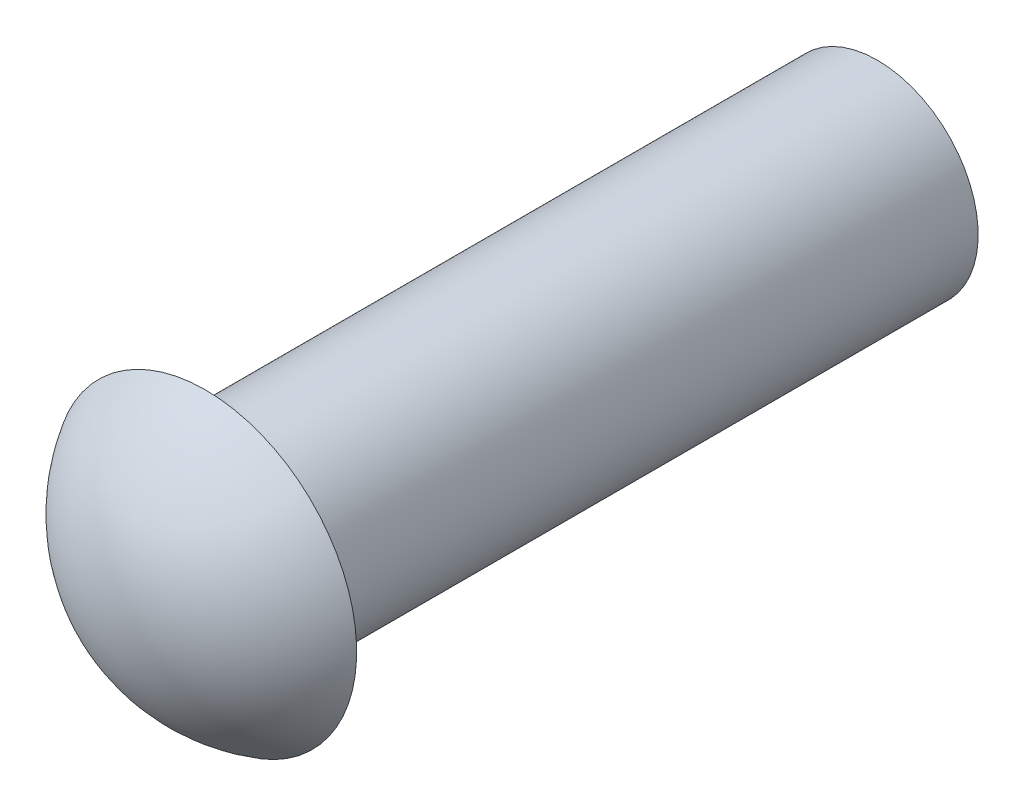
ISO-10303-21;
HEADER;
FILE_DESCRIPTION(('STEP AP214'),'2;1');
FILE_NAME('part.step','',(''),(''),'','','');
FILE_SCHEMA(('AUTOMOTIVE_DESIGN { 1 0 10303 214 1 1 1 1 }'));
ENDSEC;
DATA;
#1=APPLICATION_CONTEXT('core data for automotive mechanical design processes');
#2=APPLICATION_PROTOCOL_DEFINITION('international standard','automotive_design',2000,#1);
#3=PRODUCT_CONTEXT('',#1,'mechanical');
#4=PRODUCT('Part','Part','',(#3));
#5=PRODUCT_RELATED_PRODUCT_CATEGORY('part','',(#4));
#6=PRODUCT_DEFINITION_FORMATION('','',#4);
#7=PRODUCT_DEFINITION_CONTEXT('part definition',#1,'design');
#8=PRODUCT_DEFINITION('design','',#6,#7);
#9=PRODUCT_DEFINITION_SHAPE('','',#8);
#10=(LENGTH_UNIT() NAMED_UNIT(*) SI_UNIT(.MILLI.,.METRE.));
#11=(NAMED_UNIT(*) PLANE_ANGLE_UNIT() SI_UNIT($,.RADIAN.));
#12=(NAMED_UNIT(*) SI_UNIT($,.STERADIAN.) SOLID_ANGLE_UNIT());
#13=UNCERTAINTY_MEASURE_WITH_UNIT(LENGTH_MEASURE(1.E-05),#10,'distance_accuracy_value','');
#14=(GEOMETRIC_REPRESENTATION_CONTEXT(3) GLOBAL_UNCERTAINTY_ASSIGNED_CONTEXT((#13)) GLOBAL_UNIT_ASSIGNED_CONTEXT((#10,
#11,#12)) REPRESENTATION_CONTEXT('',''));
#15=CARTESIAN_POINT('',(0.,0.,0.));
#16=DIRECTION('',(0.,0.,1.));
#17=DIRECTION('',(1.,0.,0.));
#18=AXIS2_PLACEMENT_3D('',#15,#16,#17);
#19=CARTESIAN_POINT('',(0.,0.,0.));
#20=DIRECTION('',(0.,0.,1.));
#21=DIRECTION('',(0.,-1.,0.));
#22=AXIS2_PLACEMENT_3D('',#19,#20,#21);
#23=PLANE('',#22);
#24=CARTESIAN_POINT('',(0.,-3.000000096,0.));
#25=DIRECTION('',(0.,0.,-1.));
#26=DIRECTION('',(0.,1.,0.));
#27=AXIS2_PLACEMENT_3D('',#24,#25,#26);
#28=CIRCLE('',#27,3.000000096);
#29=CARTESIAN_POINT('',(0.,0.,0.));
#30=VERTEX_POINT('',#29);
#31=EDGE_CURVE('E10',#30,#30,#28,.T.);
#32=ORIENTED_EDGE('',*,*,#31,.T.);
#33=EDGE_LOOP('',(#32));
#34=FACE_BOUND('',#33,.T.);
#35=ADVANCED_FACE('F45',(#34),#23,.F.);
#36=CARTESIAN_POINT('',(0.,-3.000000096,0.));
#37=DIRECTION('',(0.,0.,-1.));
#38=DIRECTION('',(0.,1.,0.));
#39=AXIS2_PLACEMENT_3D('',#36,#37,#38);
#40=CYLINDRICAL_SURFACE('',#39,3.000000096);
#41=CARTESIAN_POINT('',(0.,-3.000000096,19.999999878));
#42=DIRECTION('',(0.,0.,-1.));
#43=DIRECTION('',(0.,1.,0.));
#44=AXIS2_PLACEMENT_3D('',#41,#42,#43);
#45=CIRCLE('',#44,3.000000096);
#46=CARTESIAN_POINT('',(0.,0.,19.999999878));
#47=VERTEX_POINT('',#46);
#48=EDGE_CURVE('E52',#47,#47,#45,.T.);
#49=ORIENTED_EDGE('',*,*,#48,.T.);
#50=EDGE_LOOP('',(#49));
#51=FACE_BOUND('',#50,.T.);
#52=ORIENTED_EDGE('',*,*,#31,.F.);
#53=EDGE_LOOP('',(#52));
#54=FACE_BOUND('',#53,.T.);
#55=ADVANCED_FACE('F74',(#51,#54),#40,.T.);
#56=CARTESIAN_POINT('',(0.,0.,19.999999878));
#57=DIRECTION('',(0.,0.,-1.));
#58=DIRECTION('',(0.,1.,0.));
#59=AXIS2_PLACEMENT_3D('',#56,#57,#58);
#60=PLANE('',#59);
#61=CARTESIAN_POINT('',(0.,-3.000000096,19.999999878));
#62=DIRECTION('',(0.,0.,-1.));
#63=DIRECTION('',(0.,1.,0.));
#64=AXIS2_PLACEMENT_3D('',#61,#62,#63);
#65=CIRCLE('',#64,4.49999989000001);
#66=CARTESIAN_POINT('',(0.,1.499999794,19.999999878));
#67=VERTEX_POINT('',#66);
#68=EDGE_CURVE('E57',#67,#67,#65,.T.);
#69=ORIENTED_EDGE('',*,*,#68,.T.);
#70=EDGE_LOOP('',(#69));
#71=FACE_BOUND('',#70,.T.);
#72=ORIENTED_EDGE('',*,*,#48,.F.);
#73=EDGE_LOOP('',(#72));
#74=FACE_BOUND('',#73,.T.);
#75=ADVANCED_FACE('F65',(#71,#74),#60,.T.);
#76=CARTESIAN_POINT('',(0.,-3.000000096,17.4019237301552));
#77=DIRECTION('',(0.,0.,-1.));
#78=DIRECTION('',(0.,1.,0.));
#79=AXIS2_PLACEMENT_3D('',#76,#77,#78);
#80=SPHERICAL_SURFACE('',#79,5.19615229568959);
#81=ORIENTED_EDGE('',*,*,#68,.F.);
#82=EDGE_LOOP('',(#81));
#83=FACE_BOUND('',#82,.T.);
#84=ADVANCED_FACE('F68',(#83),#80,.T.);
#85=CLOSED_SHELL('',(#35,#55,#75,#84));
#86=MANIFOLD_SOLID_BREP('B2',#85);
#87=ADVANCED_BREP_SHAPE_REPRESENTATION('',(#18,#86),#14);
#88=SHAPE_DEFINITION_REPRESENTATION(#9,#87);
ENDSEC;
END-ISO-10303-21;
